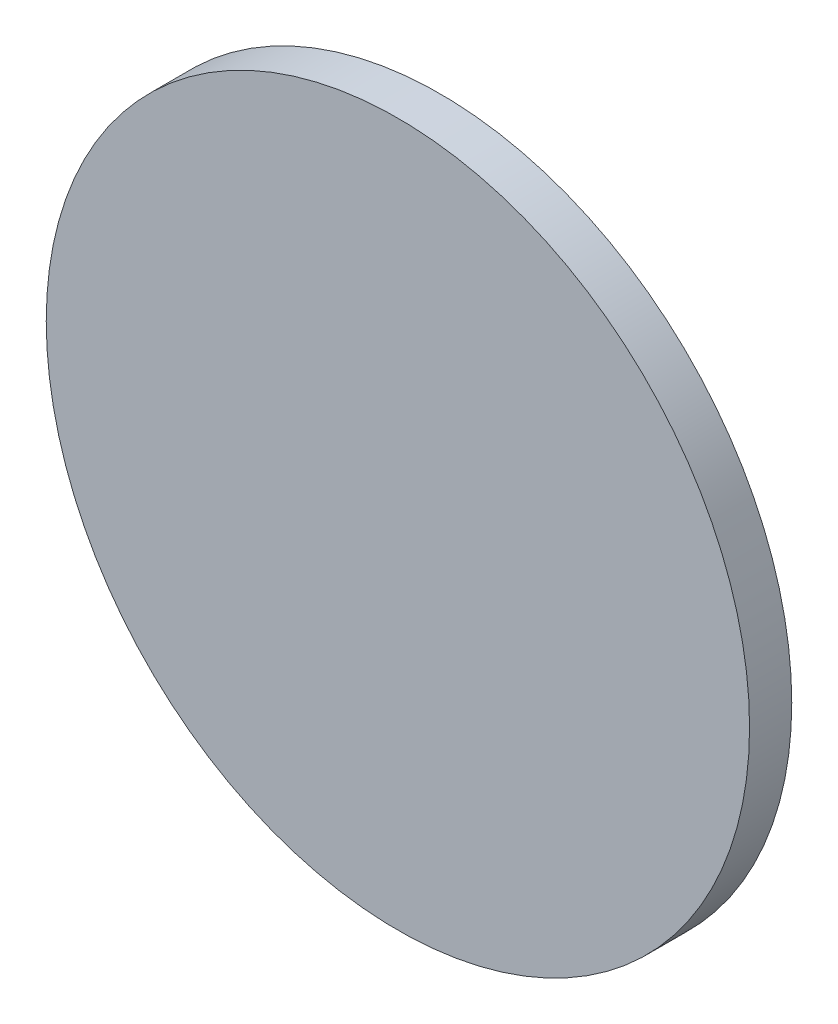
ISO-10303-21;
HEADER;
FILE_DESCRIPTION(('STEP AP214'),'2;1');
FILE_NAME('part.step','',(''),(''),'','','');
FILE_SCHEMA(('AUTOMOTIVE_DESIGN { 1 0 10303 214 1 1 1 1 }'));
ENDSEC;
DATA;
#1=APPLICATION_CONTEXT('core data for automotive mechanical design processes');
#2=APPLICATION_PROTOCOL_DEFINITION('international standard','automotive_design',2000,#1);
#3=PRODUCT_CONTEXT('',#1,'mechanical');
#4=PRODUCT('Part','Part','',(#3));
#5=PRODUCT_RELATED_PRODUCT_CATEGORY('part','',(#4));
#6=PRODUCT_DEFINITION_FORMATION('','',#4);
#7=PRODUCT_DEFINITION_CONTEXT('part definition',#1,'design');
#8=PRODUCT_DEFINITION('design','',#6,#7);
#9=PRODUCT_DEFINITION_SHAPE('','',#8);
#10=(LENGTH_UNIT() NAMED_UNIT(*) SI_UNIT(.MILLI.,.METRE.));
#11=(NAMED_UNIT(*) PLANE_ANGLE_UNIT() SI_UNIT($,.RADIAN.));
#12=(NAMED_UNIT(*) SI_UNIT($,.STERADIAN.) SOLID_ANGLE_UNIT());
#13=UNCERTAINTY_MEASURE_WITH_UNIT(LENGTH_MEASURE(1.E-05),#10,'distance_accuracy_value','');
#14=(GEOMETRIC_REPRESENTATION_CONTEXT(3) GLOBAL_UNCERTAINTY_ASSIGNED_CONTEXT((#13)) GLOBAL_UNIT_ASSIGNED_CONTEXT((#10,
#11,#12)) REPRESENTATION_CONTEXT('',''));
#15=CARTESIAN_POINT('',(0.,0.,0.));
#16=DIRECTION('',(0.,0.,1.));
#17=DIRECTION('',(1.,0.,0.));
#18=AXIS2_PLACEMENT_3D('',#15,#16,#17);
#19=CARTESIAN_POINT('',(0.,0.,1.6));
#20=DIRECTION('',(0.,0.,-1.));
#21=DIRECTION('',(-1.,0.,0.));
#22=AXIS2_PLACEMENT_3D('',#19,#20,#21);
#23=PLANE('',#22);
#24=CARTESIAN_POINT('',(1.5,2.,1.6));
#25=DIRECTION('',(0.,0.,-1.));
#26=DIRECTION('',(-1.,0.,0.));
#27=AXIS2_PLACEMENT_3D('',#24,#25,#26);
#28=CIRCLE('',#27,12.5);
#29=CARTESIAN_POINT('',(-11.,2.,1.6));
#30=VERTEX_POINT('',#29);
#31=EDGE_CURVE('E18',#30,#30,#28,.F.);
#32=ORIENTED_EDGE('',*,*,#31,.F.);
#33=EDGE_LOOP('',(#32));
#34=FACE_BOUND('',#33,.T.);
#35=ADVANCED_FACE('F15',(#34),#23,.T.);
#36=CARTESIAN_POINT('',(1.5,2.,3.1));
#37=DIRECTION('',(0.,0.,-1.));
#38=DIRECTION('',(-1.,0.,0.));
#39=AXIS2_PLACEMENT_3D('',#36,#37,#38);
#40=CYLINDRICAL_SURFACE('',#39,12.5);
#41=CARTESIAN_POINT('',(1.5,2.,3.1));
#42=DIRECTION('',(0.,0.,-1.));
#43=DIRECTION('',(-1.,0.,0.));
#44=AXIS2_PLACEMENT_3D('',#41,#42,#43);
#45=CIRCLE('',#44,12.5);
#46=CARTESIAN_POINT('',(-11.,2.,3.1));
#47=VERTEX_POINT('',#46);
#48=EDGE_CURVE('E10',#47,#47,#45,.T.);
#49=ORIENTED_EDGE('',*,*,#48,.T.);
#50=EDGE_LOOP('',(#49));
#51=FACE_BOUND('',#50,.T.);
#52=ORIENTED_EDGE('',*,*,#31,.T.);
#53=EDGE_LOOP('',(#52));
#54=FACE_BOUND('',#53,.T.);
#55=ADVANCED_FACE('F27',(#51,#54),#40,.T.);
#56=CARTESIAN_POINT('',(0.,0.,3.1));
#57=DIRECTION('',(0.,0.,-1.));
#58=DIRECTION('',(-1.,0.,0.));
#59=AXIS2_PLACEMENT_3D('',#56,#57,#58);
#60=PLANE('',#59);
#61=ORIENTED_EDGE('',*,*,#48,.F.);
#62=EDGE_LOOP('',(#61));
#63=FACE_BOUND('',#62,.T.);
#64=ADVANCED_FACE('F34',(#63),#60,.F.);
#65=CLOSED_SHELL('',(#35,#55,#64));
#66=MANIFOLD_SOLID_BREP('B1',#65);
#67=ADVANCED_BREP_SHAPE_REPRESENTATION('',(#18,#66),#14);
#68=SHAPE_DEFINITION_REPRESENTATION(#9,#67);
ENDSEC;
END-ISO-10303-21;
